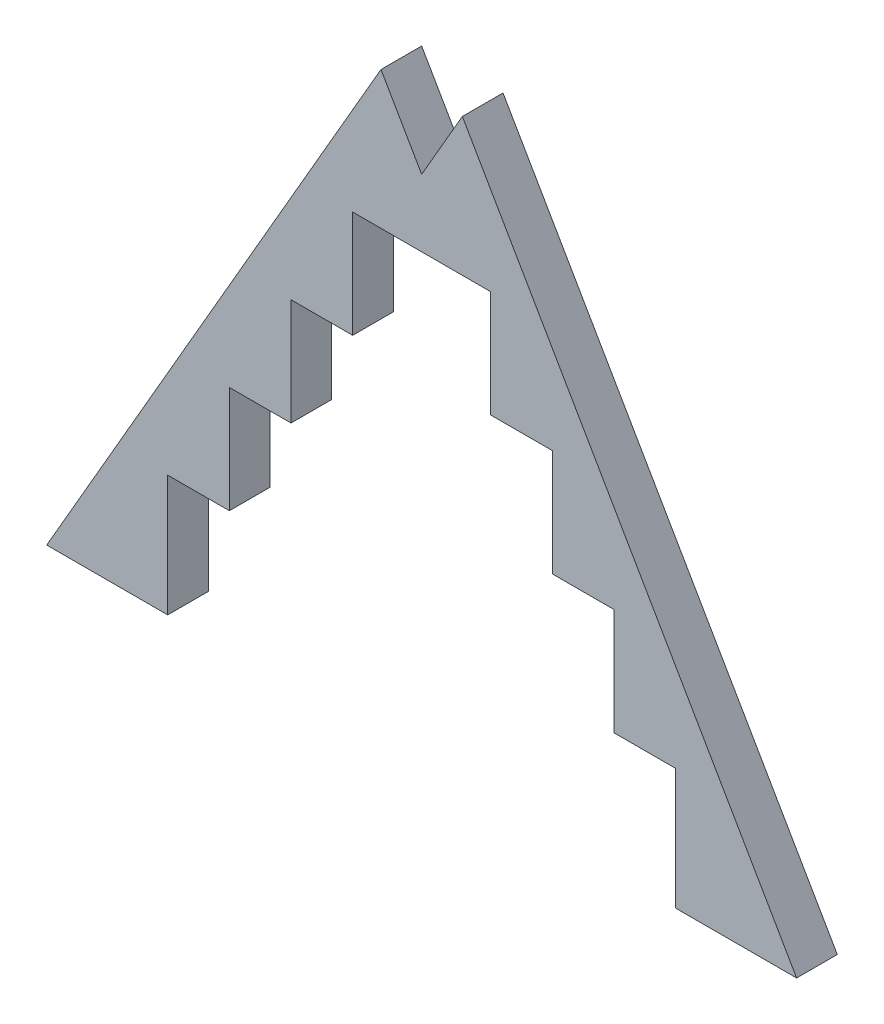
ISO-10303-21;
HEADER;
FILE_DESCRIPTION(('STEP AP214'),'2;1');
FILE_NAME('part.step','',(''),(''),'','','');
FILE_SCHEMA(('AUTOMOTIVE_DESIGN { 1 0 10303 214 1 1 1 1 }'));
ENDSEC;
DATA;
#1=APPLICATION_CONTEXT('core data for automotive mechanical design processes');
#2=APPLICATION_PROTOCOL_DEFINITION('international standard','automotive_design',2000,#1);
#3=PRODUCT_CONTEXT('',#1,'mechanical');
#4=PRODUCT('Part','Part','',(#3));
#5=PRODUCT_RELATED_PRODUCT_CATEGORY('part','',(#4));
#6=PRODUCT_DEFINITION_FORMATION('','',#4);
#7=PRODUCT_DEFINITION_CONTEXT('part definition',#1,'design');
#8=PRODUCT_DEFINITION('design','',#6,#7);
#9=PRODUCT_DEFINITION_SHAPE('','',#8);
#10=(LENGTH_UNIT() NAMED_UNIT(*) SI_UNIT(.MILLI.,.METRE.));
#11=(NAMED_UNIT(*) PLANE_ANGLE_UNIT() SI_UNIT($,.RADIAN.));
#12=(NAMED_UNIT(*) SI_UNIT($,.STERADIAN.) SOLID_ANGLE_UNIT());
#13=UNCERTAINTY_MEASURE_WITH_UNIT(LENGTH_MEASURE(1.E-05),#10,'distance_accuracy_value','');
#14=(GEOMETRIC_REPRESENTATION_CONTEXT(3) GLOBAL_UNCERTAINTY_ASSIGNED_CONTEXT((#13)) GLOBAL_UNIT_ASSIGNED_CONTEXT((#10,
#11,#12)) REPRESENTATION_CONTEXT('',''));
#15=CARTESIAN_POINT('',(0.,0.,0.));
#16=DIRECTION('',(0.,0.,1.));
#17=DIRECTION('',(1.,0.,0.));
#18=AXIS2_PLACEMENT_3D('',#15,#16,#17);
#19=CARTESIAN_POINT('',(-9.45391108675444,5.95,2.));
#20=DIRECTION('',(0.,1.,0.));
#21=DIRECTION('',(0.,0.,1.));
#22=AXIS2_PLACEMENT_3D('',#19,#20,#21);
#23=PLANE('',#22);
#24=DIRECTION('',(1.,0.,0.));
#25=VECTOR('',#24,1.);
#26=CARTESIAN_POINT('',(-9.45391108675444,5.95,0.));
#27=LINE('',#26,#25);
#28=CARTESIAN_POINT('',(-12.485,5.95,0.));
#29=VERTEX_POINT('',#28);
#30=CARTESIAN_POINT('',(-9.45391108675444,5.95,0.));
#31=VERTEX_POINT('',#30);
#32=EDGE_CURVE('E209',#29,#31,#27,.T.);
#33=ORIENTED_EDGE('',*,*,#32,.T.);
#34=DIRECTION('',(0.,0.,-1.));
#35=VECTOR('',#34,1.);
#36=CARTESIAN_POINT('',(-9.45391108675444,5.95,2.));
#37=LINE('',#36,#35);
#38=CARTESIAN_POINT('',(-9.45391108675444,5.95,2.));
#39=VERTEX_POINT('',#38);
#40=EDGE_CURVE('E11',#39,#31,#37,.T.);
#41=ORIENTED_EDGE('',*,*,#40,.F.);
#42=DIRECTION('',(1.,0.,0.));
#43=VECTOR('',#42,1.);
#44=CARTESIAN_POINT('',(-9.45391108675444,5.95,2.));
#45=LINE('',#44,#43);
#46=CARTESIAN_POINT('',(-12.485,5.95,2.));
#47=VERTEX_POINT('',#46);
#48=EDGE_CURVE('E249',#47,#39,#45,.T.);
#49=ORIENTED_EDGE('',*,*,#48,.F.);
#50=DIRECTION('',(0.,0.,-1.));
#51=VECTOR('',#50,1.);
#52=CARTESIAN_POINT('',(-12.485,5.95,2.));
#53=LINE('',#52,#51);
#54=EDGE_CURVE('E205',#47,#29,#53,.T.);
#55=ORIENTED_EDGE('',*,*,#54,.T.);
#56=EDGE_LOOP('',(#33,#41,#49,#55));
#57=FACE_BOUND('',#56,.T.);
#58=ADVANCED_FACE('F35',(#57),#23,.F.);
#59=CARTESIAN_POINT('',(-9.45391108675444,11.2,2.));
#60=DIRECTION('',(-1.,0.,0.));
#61=DIRECTION('',(0.,0.,1.));
#62=AXIS2_PLACEMENT_3D('',#59,#60,#61);
#63=PLANE('',#62);
#64=DIRECTION('',(0.,1.,0.));
#65=VECTOR('',#64,1.);
#66=CARTESIAN_POINT('',(-9.45391108675444,11.2,0.));
#67=LINE('',#66,#65);
#68=CARTESIAN_POINT('',(-9.45391108675444,11.2,0.));
#69=VERTEX_POINT('',#68);
#70=EDGE_CURVE('E212',#31,#69,#67,.T.);
#71=ORIENTED_EDGE('',*,*,#70,.T.);
#72=DIRECTION('',(0.,0.,-1.));
#73=VECTOR('',#72,1.);
#74=CARTESIAN_POINT('',(-9.45391108675444,11.2,2.));
#75=LINE('',#74,#73);
#76=CARTESIAN_POINT('',(-9.45391108675444,11.2,2.));
#77=VERTEX_POINT('',#76);
#78=EDGE_CURVE('E43',#77,#69,#75,.T.);
#79=ORIENTED_EDGE('',*,*,#78,.F.);
#80=DIRECTION('',(0.,1.,0.));
#81=VECTOR('',#80,1.);
#82=CARTESIAN_POINT('',(-9.45391108675444,11.2,2.));
#83=LINE('',#82,#81);
#84=EDGE_CURVE('E133',#39,#77,#83,.T.);
#85=ORIENTED_EDGE('',*,*,#84,.F.);
#86=ORIENTED_EDGE('',*,*,#40,.T.);
#87=EDGE_LOOP('',(#71,#79,#85,#86));
#88=FACE_BOUND('',#87,.T.);
#89=ADVANCED_FACE('F372',(#88),#63,.F.);
#90=CARTESIAN_POINT('',(-6.42282217350887,11.2,2.));
#91=DIRECTION('',(0.,1.,0.));
#92=DIRECTION('',(0.,0.,1.));
#93=AXIS2_PLACEMENT_3D('',#90,#91,#92);
#94=PLANE('',#93);
#95=DIRECTION('',(1.,0.,0.));
#96=VECTOR('',#95,1.);
#97=CARTESIAN_POINT('',(-6.42282217350887,11.2,0.));
#98=LINE('',#97,#96);
#99=CARTESIAN_POINT('',(-6.42282217350887,11.2,0.));
#100=VERTEX_POINT('',#99);
#101=EDGE_CURVE('E214',#69,#100,#98,.T.);
#102=ORIENTED_EDGE('',*,*,#101,.T.);
#103=DIRECTION('',(0.,0.,-1.));
#104=VECTOR('',#103,1.);
#105=CARTESIAN_POINT('',(-6.42282217350887,11.2,2.));
#106=LINE('',#105,#104);
#107=CARTESIAN_POINT('',(-6.42282217350887,11.2,2.));
#108=VERTEX_POINT('',#107);
#109=EDGE_CURVE('E295',#108,#100,#106,.T.);
#110=ORIENTED_EDGE('',*,*,#109,.F.);
#111=DIRECTION('',(1.,0.,0.));
#112=VECTOR('',#111,1.);
#113=CARTESIAN_POINT('',(-6.42282217350887,11.2,2.));
#114=LINE('',#113,#112);
#115=EDGE_CURVE('E303',#77,#108,#114,.T.);
#116=ORIENTED_EDGE('',*,*,#115,.F.);
#117=ORIENTED_EDGE('',*,*,#78,.T.);
#118=EDGE_LOOP('',(#102,#110,#116,#117));
#119=FACE_BOUND('',#118,.T.);
#120=ADVANCED_FACE('F301',(#119),#94,.F.);
#121=CARTESIAN_POINT('',(-6.42282217350887,16.45,2.));
#122=DIRECTION('',(-1.,0.,0.));
#123=DIRECTION('',(0.,0.,1.));
#124=AXIS2_PLACEMENT_3D('',#121,#122,#123);
#125=PLANE('',#124);
#126=DIRECTION('',(0.,1.,0.));
#127=VECTOR('',#126,1.);
#128=CARTESIAN_POINT('',(-6.42282217350887,16.45,0.));
#129=LINE('',#128,#127);
#130=CARTESIAN_POINT('',(-6.42282217350887,16.45,0.));
#131=VERTEX_POINT('',#130);
#132=EDGE_CURVE('E216',#100,#131,#129,.T.);
#133=ORIENTED_EDGE('',*,*,#132,.T.);
#134=DIRECTION('',(0.,0.,-1.));
#135=VECTOR('',#134,1.);
#136=CARTESIAN_POINT('',(-6.42282217350887,16.45,2.));
#137=LINE('',#136,#135);
#138=CARTESIAN_POINT('',(-6.42282217350887,16.45,2.));
#139=VERTEX_POINT('',#138);
#140=EDGE_CURVE('E292',#139,#131,#137,.T.);
#141=ORIENTED_EDGE('',*,*,#140,.F.);
#142=DIRECTION('',(0.,1.,0.));
#143=VECTOR('',#142,1.);
#144=CARTESIAN_POINT('',(-6.42282217350887,16.45,2.));
#145=LINE('',#144,#143);
#146=EDGE_CURVE('E321',#108,#139,#145,.T.);
#147=ORIENTED_EDGE('',*,*,#146,.F.);
#148=ORIENTED_EDGE('',*,*,#109,.T.);
#149=EDGE_LOOP('',(#133,#141,#147,#148));
#150=FACE_BOUND('',#149,.T.);
#151=ADVANCED_FACE('F312',(#150),#125,.F.);
#152=CARTESIAN_POINT('',(-3.3917332602633,16.45,2.));
#153=DIRECTION('',(0.,1.,0.));
#154=DIRECTION('',(0.,0.,1.));
#155=AXIS2_PLACEMENT_3D('',#152,#153,#154);
#156=PLANE('',#155);
#157=DIRECTION('',(1.,0.,0.));
#158=VECTOR('',#157,1.);
#159=CARTESIAN_POINT('',(-3.3917332602633,16.45,0.));
#160=LINE('',#159,#158);
#161=CARTESIAN_POINT('',(-3.3917332602633,16.45,0.));
#162=VERTEX_POINT('',#161);
#163=EDGE_CURVE('E218',#131,#162,#160,.T.);
#164=ORIENTED_EDGE('',*,*,#163,.T.);
#165=DIRECTION('',(0.,0.,-1.));
#166=VECTOR('',#165,1.);
#167=CARTESIAN_POINT('',(-3.3917332602633,16.45,2.));
#168=LINE('',#167,#166);
#169=CARTESIAN_POINT('',(-3.3917332602633,16.45,2.));
#170=VERTEX_POINT('',#169);
#171=EDGE_CURVE('E289',#170,#162,#168,.T.);
#172=ORIENTED_EDGE('',*,*,#171,.F.);
#173=DIRECTION('',(1.,0.,0.));
#174=VECTOR('',#173,1.);
#175=CARTESIAN_POINT('',(-3.3917332602633,16.45,2.));
#176=LINE('',#175,#174);
#177=EDGE_CURVE('E318',#139,#170,#176,.T.);
#178=ORIENTED_EDGE('',*,*,#177,.F.);
#179=ORIENTED_EDGE('',*,*,#140,.T.);
#180=EDGE_LOOP('',(#164,#172,#178,#179));
#181=FACE_BOUND('',#180,.T.);
#182=ADVANCED_FACE('F316',(#181),#156,.F.);
#183=CARTESIAN_POINT('',(-3.3917332602633,21.7,2.));
#184=DIRECTION('',(-1.,0.,0.));
#185=DIRECTION('',(0.,0.,1.));
#186=AXIS2_PLACEMENT_3D('',#183,#184,#185);
#187=PLANE('',#186);
#188=DIRECTION('',(0.,1.,0.));
#189=VECTOR('',#188,1.);
#190=CARTESIAN_POINT('',(-3.3917332602633,21.7,0.));
#191=LINE('',#190,#189);
#192=CARTESIAN_POINT('',(-3.3917332602633,21.7,0.));
#193=VERTEX_POINT('',#192);
#194=EDGE_CURVE('E220',#162,#193,#191,.T.);
#195=ORIENTED_EDGE('',*,*,#194,.T.);
#196=DIRECTION('',(0.,0.,-1.));
#197=VECTOR('',#196,1.);
#198=CARTESIAN_POINT('',(-3.3917332602633,21.7,2.));
#199=LINE('',#198,#197);
#200=CARTESIAN_POINT('',(-3.3917332602633,21.7,2.));
#201=VERTEX_POINT('',#200);
#202=EDGE_CURVE('E286',#201,#193,#199,.T.);
#203=ORIENTED_EDGE('',*,*,#202,.F.);
#204=DIRECTION('',(0.,1.,0.));
#205=VECTOR('',#204,1.);
#206=CARTESIAN_POINT('',(-3.3917332602633,21.7,2.));
#207=LINE('',#206,#205);
#208=EDGE_CURVE('E320',#170,#201,#207,.T.);
#209=ORIENTED_EDGE('',*,*,#208,.F.);
#210=ORIENTED_EDGE('',*,*,#171,.T.);
#211=EDGE_LOOP('',(#195,#203,#209,#210));
#212=FACE_BOUND('',#211,.T.);
#213=ADVANCED_FACE('F385',(#212),#187,.F.);
#214=CARTESIAN_POINT('',(-3.3917332602633,21.7,2.));
#215=DIRECTION('',(0.,1.,0.));
#216=DIRECTION('',(0.,0.,1.));
#217=AXIS2_PLACEMENT_3D('',#214,#215,#216);
#218=PLANE('',#217);
#219=DIRECTION('',(1.,0.,0.));
#220=VECTOR('',#219,1.);
#221=CARTESIAN_POINT('',(-3.3917332602633,21.7,0.));
#222=LINE('',#221,#220);
#223=CARTESIAN_POINT('',(3.3917332602633,21.7,0.));
#224=VERTEX_POINT('',#223);
#225=EDGE_CURVE('E222',#193,#224,#222,.T.);
#226=ORIENTED_EDGE('',*,*,#225,.T.);
#227=DIRECTION('',(0.,0.,-1.));
#228=VECTOR('',#227,1.);
#229=CARTESIAN_POINT('',(3.3917332602633,21.7,2.));
#230=LINE('',#229,#228);
#231=CARTESIAN_POINT('',(3.3917332602633,21.7,2.));
#232=VERTEX_POINT('',#231);
#233=EDGE_CURVE('E283',#232,#224,#230,.T.);
#234=ORIENTED_EDGE('',*,*,#233,.F.);
#235=DIRECTION('',(1.,0.,0.));
#236=VECTOR('',#235,1.);
#237=CARTESIAN_POINT('',(-3.3917332602633,21.7,2.));
#238=LINE('',#237,#236);
#239=EDGE_CURVE('E323',#201,#232,#238,.T.);
#240=ORIENTED_EDGE('',*,*,#239,.F.);
#241=ORIENTED_EDGE('',*,*,#202,.T.);
#242=EDGE_LOOP('',(#226,#234,#240,#241));
#243=FACE_BOUND('',#242,.T.);
#244=ADVANCED_FACE('F388',(#243),#218,.F.);
#245=CARTESIAN_POINT('',(3.3917332602633,21.7,2.));
#246=DIRECTION('',(1.,0.,0.));
#247=DIRECTION('',(0.,0.,-1.));
#248=AXIS2_PLACEMENT_3D('',#245,#246,#247);
#249=PLANE('',#248);
#250=DIRECTION('',(0.,-1.,0.));
#251=VECTOR('',#250,1.);
#252=CARTESIAN_POINT('',(3.3917332602633,21.7,0.));
#253=LINE('',#252,#251);
#254=CARTESIAN_POINT('',(3.3917332602633,16.45,0.));
#255=VERTEX_POINT('',#254);
#256=EDGE_CURVE('E224',#224,#255,#253,.T.);
#257=ORIENTED_EDGE('',*,*,#256,.T.);
#258=DIRECTION('',(0.,0.,-1.));
#259=VECTOR('',#258,1.);
#260=CARTESIAN_POINT('',(3.3917332602633,16.45,2.));
#261=LINE('',#260,#259);
#262=CARTESIAN_POINT('',(3.3917332602633,16.45,2.));
#263=VERTEX_POINT('',#262);
#264=EDGE_CURVE('E280',#263,#255,#261,.T.);
#265=ORIENTED_EDGE('',*,*,#264,.F.);
#266=DIRECTION('',(0.,-1.,0.));
#267=VECTOR('',#266,1.);
#268=CARTESIAN_POINT('',(3.3917332602633,21.7,2.));
#269=LINE('',#268,#267);
#270=EDGE_CURVE('E329',#232,#263,#269,.T.);
#271=ORIENTED_EDGE('',*,*,#270,.F.);
#272=ORIENTED_EDGE('',*,*,#233,.T.);
#273=EDGE_LOOP('',(#257,#265,#271,#272));
#274=FACE_BOUND('',#273,.T.);
#275=ADVANCED_FACE('F392',(#274),#249,.F.);
#276=CARTESIAN_POINT('',(3.3917332602633,16.45,2.));
#277=DIRECTION('',(0.,1.,0.));
#278=DIRECTION('',(0.,0.,1.));
#279=AXIS2_PLACEMENT_3D('',#276,#277,#278);
#280=PLANE('',#279);
#281=DIRECTION('',(1.,0.,0.));
#282=VECTOR('',#281,1.);
#283=CARTESIAN_POINT('',(3.3917332602633,16.45,0.));
#284=LINE('',#283,#282);
#285=CARTESIAN_POINT('',(6.42282217350887,16.45,0.));
#286=VERTEX_POINT('',#285);
#287=EDGE_CURVE('E226',#255,#286,#284,.T.);
#288=ORIENTED_EDGE('',*,*,#287,.T.);
#289=DIRECTION('',(0.,0.,-1.));
#290=VECTOR('',#289,1.);
#291=CARTESIAN_POINT('',(6.42282217350887,16.45,2.));
#292=LINE('',#291,#290);
#293=CARTESIAN_POINT('',(6.42282217350887,16.45,2.));
#294=VERTEX_POINT('',#293);
#295=EDGE_CURVE('E277',#294,#286,#292,.T.);
#296=ORIENTED_EDGE('',*,*,#295,.F.);
#297=DIRECTION('',(1.,0.,0.));
#298=VECTOR('',#297,1.);
#299=CARTESIAN_POINT('',(3.3917332602633,16.45,2.));
#300=LINE('',#299,#298);
#301=EDGE_CURVE('E331',#263,#294,#300,.T.);
#302=ORIENTED_EDGE('',*,*,#301,.F.);
#303=ORIENTED_EDGE('',*,*,#264,.T.);
#304=EDGE_LOOP('',(#288,#296,#302,#303));
#305=FACE_BOUND('',#304,.T.);
#306=ADVANCED_FACE('F396',(#305),#280,.F.);
#307=CARTESIAN_POINT('',(6.42282217350887,16.45,2.));
#308=DIRECTION('',(1.,0.,0.));
#309=DIRECTION('',(0.,0.,-1.));
#310=AXIS2_PLACEMENT_3D('',#307,#308,#309);
#311=PLANE('',#310);
#312=DIRECTION('',(0.,-1.,0.));
#313=VECTOR('',#312,1.);
#314=CARTESIAN_POINT('',(6.42282217350887,16.45,0.));
#315=LINE('',#314,#313);
#316=CARTESIAN_POINT('',(6.42282217350887,11.2,0.));
#317=VERTEX_POINT('',#316);
#318=EDGE_CURVE('E228',#286,#317,#315,.T.);
#319=ORIENTED_EDGE('',*,*,#318,.T.);
#320=DIRECTION('',(0.,0.,-1.));
#321=VECTOR('',#320,1.);
#322=CARTESIAN_POINT('',(6.42282217350887,11.2,2.));
#323=LINE('',#322,#321);
#324=CARTESIAN_POINT('',(6.42282217350887,11.2,2.));
#325=VERTEX_POINT('',#324);
#326=EDGE_CURVE('E274',#325,#317,#323,.T.);
#327=ORIENTED_EDGE('',*,*,#326,.F.);
#328=DIRECTION('',(0.,-1.,0.));
#329=VECTOR('',#328,1.);
#330=CARTESIAN_POINT('',(6.42282217350887,16.45,2.));
#331=LINE('',#330,#329);
#332=EDGE_CURVE('E333',#294,#325,#331,.T.);
#333=ORIENTED_EDGE('',*,*,#332,.F.);
#334=ORIENTED_EDGE('',*,*,#295,.T.);
#335=EDGE_LOOP('',(#319,#327,#333,#334));
#336=FACE_BOUND('',#335,.T.);
#337=ADVANCED_FACE('F400',(#336),#311,.F.);
#338=CARTESIAN_POINT('',(6.42282217350887,11.2,2.));
#339=DIRECTION('',(0.,1.,0.));
#340=DIRECTION('',(0.,0.,1.));
#341=AXIS2_PLACEMENT_3D('',#338,#339,#340);
#342=PLANE('',#341);
#343=DIRECTION('',(1.,0.,0.));
#344=VECTOR('',#343,1.);
#345=CARTESIAN_POINT('',(6.42282217350887,11.2,0.));
#346=LINE('',#345,#344);
#347=CARTESIAN_POINT('',(9.45391108675444,11.2,0.));
#348=VERTEX_POINT('',#347);
#349=EDGE_CURVE('E230',#317,#348,#346,.T.);
#350=ORIENTED_EDGE('',*,*,#349,.T.);
#351=DIRECTION('',(0.,0.,-1.));
#352=VECTOR('',#351,1.);
#353=CARTESIAN_POINT('',(9.45391108675444,11.2,2.));
#354=LINE('',#353,#352);
#355=CARTESIAN_POINT('',(9.45391108675444,11.2,2.));
#356=VERTEX_POINT('',#355);
#357=EDGE_CURVE('E271',#356,#348,#354,.T.);
#358=ORIENTED_EDGE('',*,*,#357,.F.);
#359=DIRECTION('',(1.,0.,0.));
#360=VECTOR('',#359,1.);
#361=CARTESIAN_POINT('',(6.42282217350887,11.2,2.));
#362=LINE('',#361,#360);
#363=EDGE_CURVE('E335',#325,#356,#362,.T.);
#364=ORIENTED_EDGE('',*,*,#363,.F.);
#365=ORIENTED_EDGE('',*,*,#326,.T.);
#366=EDGE_LOOP('',(#350,#358,#364,#365));
#367=FACE_BOUND('',#366,.T.);
#368=ADVANCED_FACE('F404',(#367),#342,.F.);
#369=CARTESIAN_POINT('',(9.45391108675444,11.2,2.));
#370=DIRECTION('',(1.,0.,0.));
#371=DIRECTION('',(0.,0.,-1.));
#372=AXIS2_PLACEMENT_3D('',#369,#370,#371);
#373=PLANE('',#372);
#374=DIRECTION('',(0.,-1.,0.));
#375=VECTOR('',#374,1.);
#376=CARTESIAN_POINT('',(9.45391108675444,11.2,0.));
#377=LINE('',#376,#375);
#378=CARTESIAN_POINT('',(9.45391108675444,5.95,0.));
#379=VERTEX_POINT('',#378);
#380=EDGE_CURVE('E232',#348,#379,#377,.T.);
#381=ORIENTED_EDGE('',*,*,#380,.T.);
#382=DIRECTION('',(0.,0.,-1.));
#383=VECTOR('',#382,1.);
#384=CARTESIAN_POINT('',(9.45391108675444,5.95,2.));
#385=LINE('',#384,#383);
#386=CARTESIAN_POINT('',(9.45391108675444,5.95,2.));
#387=VERTEX_POINT('',#386);
#388=EDGE_CURVE('E268',#387,#379,#385,.T.);
#389=ORIENTED_EDGE('',*,*,#388,.F.);
#390=DIRECTION('',(0.,-1.,0.));
#391=VECTOR('',#390,1.);
#392=CARTESIAN_POINT('',(9.45391108675444,11.2,2.));
#393=LINE('',#392,#391);
#394=EDGE_CURVE('E337',#356,#387,#393,.T.);
#395=ORIENTED_EDGE('',*,*,#394,.F.);
#396=ORIENTED_EDGE('',*,*,#357,.T.);
#397=EDGE_LOOP('',(#381,#389,#395,#396));
#398=FACE_BOUND('',#397,.T.);
#399=ADVANCED_FACE('F408',(#398),#373,.F.);
#400=CARTESIAN_POINT('',(9.45391108675444,5.95,2.));
#401=DIRECTION('',(0.,1.,0.));
#402=DIRECTION('',(0.,0.,1.));
#403=AXIS2_PLACEMENT_3D('',#400,#401,#402);
#404=PLANE('',#403);
#405=DIRECTION('',(1.,0.,0.));
#406=VECTOR('',#405,1.);
#407=CARTESIAN_POINT('',(9.45391108675444,5.95,0.));
#408=LINE('',#407,#406);
#409=CARTESIAN_POINT('',(12.485,5.95,0.));
#410=VERTEX_POINT('',#409);
#411=EDGE_CURVE('E234',#379,#410,#408,.T.);
#412=ORIENTED_EDGE('',*,*,#411,.T.);
#413=DIRECTION('',(0.,0.,-1.));
#414=VECTOR('',#413,1.);
#415=CARTESIAN_POINT('',(12.485,5.95,2.));
#416=LINE('',#415,#414);
#417=CARTESIAN_POINT('',(12.485,5.95,2.));
#418=VERTEX_POINT('',#417);
#419=EDGE_CURVE('E265',#418,#410,#416,.T.);
#420=ORIENTED_EDGE('',*,*,#419,.F.);
#421=DIRECTION('',(1.,0.,0.));
#422=VECTOR('',#421,1.);
#423=CARTESIAN_POINT('',(9.45391108675444,5.95,2.));
#424=LINE('',#423,#422);
#425=EDGE_CURVE('E339',#387,#418,#424,.T.);
#426=ORIENTED_EDGE('',*,*,#425,.F.);
#427=ORIENTED_EDGE('',*,*,#388,.T.);
#428=EDGE_LOOP('',(#412,#420,#426,#427));
#429=FACE_BOUND('',#428,.T.);
#430=ADVANCED_FACE('F412',(#429),#404,.F.);
#431=CARTESIAN_POINT('',(12.485,5.95,2.));
#432=DIRECTION('',(1.,0.,0.));
#433=DIRECTION('',(0.,0.,-1.));
#434=AXIS2_PLACEMENT_3D('',#431,#432,#433);
#435=PLANE('',#434);
#436=DIRECTION('',(0.,-1.,0.));
#437=VECTOR('',#436,1.);
#438=CARTESIAN_POINT('',(12.485,5.95,0.));
#439=LINE('',#438,#437);
#440=CARTESIAN_POINT('',(12.485,0.,0.));
#441=VERTEX_POINT('',#440);
#442=EDGE_CURVE('E236',#410,#441,#439,.T.);
#443=ORIENTED_EDGE('',*,*,#442,.T.);
#444=DIRECTION('',(0.,0.,-1.));
#445=VECTOR('',#444,1.);
#446=CARTESIAN_POINT('',(12.485,0.,2.));
#447=LINE('',#446,#445);
#448=CARTESIAN_POINT('',(12.485,0.,2.));
#449=VERTEX_POINT('',#448);
#450=EDGE_CURVE('E262',#449,#441,#447,.T.);
#451=ORIENTED_EDGE('',*,*,#450,.F.);
#452=DIRECTION('',(0.,-1.,0.));
#453=VECTOR('',#452,1.);
#454=CARTESIAN_POINT('',(12.485,5.95,2.));
#455=LINE('',#454,#453);
#456=EDGE_CURVE('E341',#418,#449,#455,.T.);
#457=ORIENTED_EDGE('',*,*,#456,.F.);
#458=ORIENTED_EDGE('',*,*,#419,.T.);
#459=EDGE_LOOP('',(#443,#451,#457,#458));
#460=FACE_BOUND('',#459,.T.);
#461=ADVANCED_FACE('F416',(#460),#435,.F.);
#462=CARTESIAN_POINT('',(18.4337567297408,0.,2.));
#463=DIRECTION('',(0.,1.,0.));
#464=DIRECTION('',(-1.,0.,0.));
#465=AXIS2_PLACEMENT_3D('',#462,#463,#464);
#466=PLANE('',#465);
#467=DIRECTION('',(1.,0.,0.));
#468=VECTOR('',#467,1.);
#469=CARTESIAN_POINT('',(18.4337567297408,0.,0.));
#470=LINE('',#469,#468);
#471=CARTESIAN_POINT('',(18.4337567297408,0.,0.));
#472=VERTEX_POINT('',#471);
#473=EDGE_CURVE('E238',#441,#472,#470,.T.);
#474=ORIENTED_EDGE('',*,*,#473,.T.);
#475=DIRECTION('',(0.,0.,-1.));
#476=VECTOR('',#475,1.);
#477=CARTESIAN_POINT('',(18.4337567297408,0.,2.));
#478=LINE('',#477,#476);
#479=CARTESIAN_POINT('',(18.4337567297408,0.,2.));
#480=VERTEX_POINT('',#479);
#481=EDGE_CURVE('E259',#480,#472,#478,.T.);
#482=ORIENTED_EDGE('',*,*,#481,.F.);
#483=DIRECTION('',(1.,0.,0.));
#484=VECTOR('',#483,1.);
#485=CARTESIAN_POINT('',(18.4337567297408,0.,2.));
#486=LINE('',#485,#484);
#487=EDGE_CURVE('E343',#449,#480,#486,.T.);
#488=ORIENTED_EDGE('',*,*,#487,.F.);
#489=ORIENTED_EDGE('',*,*,#450,.T.);
#490=EDGE_LOOP('',(#474,#482,#488,#489));
#491=FACE_BOUND('',#490,.T.);
#492=ADVANCED_FACE('F420',(#491),#466,.F.);
#493=CARTESIAN_POINT('',(2.,28.4641016151378,2.));
#494=DIRECTION('',(-0.866025403784436,-0.500000000000004,0.));
#495=DIRECTION('',(0.500000000000004,-0.866025403784436,0.));
#496=AXIS2_PLACEMENT_3D('',#493,#494,#495);
#497=PLANE('',#496);
#498=DIRECTION('',(-0.500000000000004,0.866025403784436,0.));
#499=VECTOR('',#498,1.);
#500=CARTESIAN_POINT('',(2.,28.4641016151378,0.));
#501=LINE('',#500,#499);
#502=CARTESIAN_POINT('',(2.,28.4641016151378,0.));
#503=VERTEX_POINT('',#502);
#504=EDGE_CURVE('E240',#472,#503,#501,.T.);
#505=ORIENTED_EDGE('',*,*,#504,.T.);
#506=DIRECTION('',(0.,0.,-1.));
#507=VECTOR('',#506,1.);
#508=CARTESIAN_POINT('',(2.,28.4641016151378,2.));
#509=LINE('',#508,#507);
#510=CARTESIAN_POINT('',(2.,28.4641016151378,2.));
#511=VERTEX_POINT('',#510);
#512=EDGE_CURVE('E256',#511,#503,#509,.T.);
#513=ORIENTED_EDGE('',*,*,#512,.F.);
#514=DIRECTION('',(-0.500000000000004,0.866025403784436,0.));
#515=VECTOR('',#514,1.);
#516=CARTESIAN_POINT('',(2.,28.4641016151378,2.));
#517=LINE('',#516,#515);
#518=EDGE_CURVE('E345',#480,#511,#517,.T.);
#519=ORIENTED_EDGE('',*,*,#518,.F.);
#520=ORIENTED_EDGE('',*,*,#481,.T.);
#521=EDGE_LOOP('',(#505,#513,#519,#520));
#522=FACE_BOUND('',#521,.T.);
#523=ADVANCED_FACE('F424',(#522),#497,.F.);
#524=CARTESIAN_POINT('',(2.,28.4641016151378,2.));
#525=DIRECTION('',(0.86602540378444,-0.499999999999998,0.));
#526=DIRECTION('',(0.499999999999998,0.86602540378444,0.));
#527=AXIS2_PLACEMENT_3D('',#524,#525,#526);
#528=PLANE('',#527);
#529=DIRECTION('',(-0.499999999999998,-0.86602540378444,0.));
#530=VECTOR('',#529,1.);
#531=CARTESIAN_POINT('',(2.,28.4641016151378,0.));
#532=LINE('',#531,#530);
#533=CARTESIAN_POINT('',(0.,25.,0.));
#534=VERTEX_POINT('',#533);
#535=EDGE_CURVE('E242',#503,#534,#532,.T.);
#536=ORIENTED_EDGE('',*,*,#535,.T.);
#537=DIRECTION('',(0.,0.,-1.));
#538=VECTOR('',#537,1.);
#539=CARTESIAN_POINT('',(0.,25.,2.));
#540=LINE('',#539,#538);
#541=CARTESIAN_POINT('',(0.,25.,2.));
#542=VERTEX_POINT('',#541);
#543=EDGE_CURVE('E253',#542,#534,#540,.T.);
#544=ORIENTED_EDGE('',*,*,#543,.F.);
#545=DIRECTION('',(-0.499999999999998,-0.86602540378444,0.));
#546=VECTOR('',#545,1.);
#547=CARTESIAN_POINT('',(2.,28.4641016151378,2.));
#548=LINE('',#547,#546);
#549=EDGE_CURVE('E347',#511,#542,#548,.T.);
#550=ORIENTED_EDGE('',*,*,#549,.F.);
#551=ORIENTED_EDGE('',*,*,#512,.T.);
#552=EDGE_LOOP('',(#536,#544,#550,#551));
#553=FACE_BOUND('',#552,.T.);
#554=ADVANCED_FACE('F353',(#553),#528,.F.);
#555=CARTESIAN_POINT('',(-2.,28.4641016151378,2.));
#556=DIRECTION('',(-0.86602540378444,-0.499999999999998,0.));
#557=DIRECTION('',(0.499999999999998,-0.86602540378444,0.));
#558=AXIS2_PLACEMENT_3D('',#555,#556,#557);
#559=PLANE('',#558);
#560=DIRECTION('',(-0.499999999999998,0.86602540378444,0.));
#561=VECTOR('',#560,1.);
#562=CARTESIAN_POINT('',(-2.,28.4641016151378,0.));
#563=LINE('',#562,#561);
#564=CARTESIAN_POINT('',(-2.,28.4641016151378,0.));
#565=VERTEX_POINT('',#564);
#566=EDGE_CURVE('E244',#534,#565,#563,.T.);
#567=ORIENTED_EDGE('',*,*,#566,.T.);
#568=DIRECTION('',(0.,0.,-1.));
#569=VECTOR('',#568,1.);
#570=CARTESIAN_POINT('',(-2.,28.4641016151378,2.));
#571=LINE('',#570,#569);
#572=CARTESIAN_POINT('',(-2.,28.4641016151378,2.));
#573=VERTEX_POINT('',#572);
#574=EDGE_CURVE('E200',#573,#565,#571,.T.);
#575=ORIENTED_EDGE('',*,*,#574,.F.);
#576=DIRECTION('',(-0.499999999999998,0.86602540378444,0.));
#577=VECTOR('',#576,1.);
#578=CARTESIAN_POINT('',(-2.,28.4641016151378,2.));
#579=LINE('',#578,#577);
#580=EDGE_CURVE('E191',#542,#573,#579,.T.);
#581=ORIENTED_EDGE('',*,*,#580,.F.);
#582=ORIENTED_EDGE('',*,*,#543,.T.);
#583=EDGE_LOOP('',(#567,#575,#581,#582));
#584=FACE_BOUND('',#583,.T.);
#585=ADVANCED_FACE('F357',(#584),#559,.F.);
#586=CARTESIAN_POINT('',(-2.,28.4641016151378,2.));
#587=DIRECTION('',(0.866025403784436,-0.500000000000004,0.));
#588=DIRECTION('',(0.500000000000004,0.866025403784436,0.));
#589=AXIS2_PLACEMENT_3D('',#586,#587,#588);
#590=PLANE('',#589);
#591=DIRECTION('',(-0.500000000000004,-0.866025403784436,0.));
#592=VECTOR('',#591,1.);
#593=CARTESIAN_POINT('',(-2.,28.4641016151378,0.));
#594=LINE('',#593,#592);
#595=CARTESIAN_POINT('',(-18.4337567297408,0.,0.));
#596=VERTEX_POINT('',#595);
#597=EDGE_CURVE('E199',#565,#596,#594,.T.);
#598=ORIENTED_EDGE('',*,*,#597,.T.);
#599=DIRECTION('',(0.,0.,-1.));
#600=VECTOR('',#599,1.);
#601=CARTESIAN_POINT('',(-18.4337567297408,0.,2.));
#602=LINE('',#601,#600);
#603=CARTESIAN_POINT('',(-18.4337567297408,0.,2.));
#604=VERTEX_POINT('',#603);
#605=EDGE_CURVE('E196',#604,#596,#602,.T.);
#606=ORIENTED_EDGE('',*,*,#605,.F.);
#607=DIRECTION('',(-0.500000000000004,-0.866025403784436,0.));
#608=VECTOR('',#607,1.);
#609=CARTESIAN_POINT('',(-2.,28.4641016151378,2.));
#610=LINE('',#609,#608);
#611=EDGE_CURVE('E185',#573,#604,#610,.T.);
#612=ORIENTED_EDGE('',*,*,#611,.F.);
#613=ORIENTED_EDGE('',*,*,#574,.T.);
#614=EDGE_LOOP('',(#598,#606,#612,#613));
#615=FACE_BOUND('',#614,.T.);
#616=ADVANCED_FACE('F197',(#615),#590,.F.);
#617=CARTESIAN_POINT('',(-18.4337567297408,0.,2.));
#618=DIRECTION('',(0.,1.,0.));
#619=DIRECTION('',(-1.,0.,0.));
#620=AXIS2_PLACEMENT_3D('',#617,#618,#619);
#621=PLANE('',#620);
#622=DIRECTION('',(1.,0.,0.));
#623=VECTOR('',#622,1.);
#624=CARTESIAN_POINT('',(-18.4337567297408,0.,0.));
#625=LINE('',#624,#623);
#626=CARTESIAN_POINT('',(-12.485,0.,0.));
#627=VERTEX_POINT('',#626);
#628=EDGE_CURVE('E119',#596,#627,#625,.T.);
#629=ORIENTED_EDGE('',*,*,#628,.T.);
#630=DIRECTION('',(0.,0.,-1.));
#631=VECTOR('',#630,1.);
#632=CARTESIAN_POINT('',(-12.485,0.,2.));
#633=LINE('',#632,#631);
#634=CARTESIAN_POINT('',(-12.485,0.,2.));
#635=VERTEX_POINT('',#634);
#636=EDGE_CURVE('E201',#635,#627,#633,.T.);
#637=ORIENTED_EDGE('',*,*,#636,.F.);
#638=DIRECTION('',(1.,0.,0.));
#639=VECTOR('',#638,1.);
#640=CARTESIAN_POINT('',(-18.4337567297408,0.,2.));
#641=LINE('',#640,#639);
#642=EDGE_CURVE('E189',#604,#635,#641,.T.);
#643=ORIENTED_EDGE('',*,*,#642,.F.);
#644=ORIENTED_EDGE('',*,*,#605,.T.);
#645=EDGE_LOOP('',(#629,#637,#643,#644));
#646=FACE_BOUND('',#645,.T.);
#647=ADVANCED_FACE('F203',(#646),#621,.F.);
#648=CARTESIAN_POINT('',(-12.485,5.95,2.));
#649=DIRECTION('',(-1.,0.,0.));
#650=DIRECTION('',(0.,0.,1.));
#651=AXIS2_PLACEMENT_3D('',#648,#649,#650);
#652=PLANE('',#651);
#653=DIRECTION('',(0.,1.,0.));
#654=VECTOR('',#653,1.);
#655=CARTESIAN_POINT('',(-12.485,5.95,0.));
#656=LINE('',#655,#654);
#657=EDGE_CURVE('E125',#627,#29,#656,.T.);
#658=ORIENTED_EDGE('',*,*,#657,.T.);
#659=ORIENTED_EDGE('',*,*,#54,.F.);
#660=DIRECTION('',(0.,1.,0.));
#661=VECTOR('',#660,1.);
#662=CARTESIAN_POINT('',(-12.485,5.95,2.));
#663=LINE('',#662,#661);
#664=EDGE_CURVE('E51',#635,#47,#663,.T.);
#665=ORIENTED_EDGE('',*,*,#664,.F.);
#666=ORIENTED_EDGE('',*,*,#636,.T.);
#667=EDGE_LOOP('',(#658,#659,#665,#666));
#668=FACE_BOUND('',#667,.T.);
#669=ADVANCED_FACE('F361',(#668),#652,.F.);
#670=CARTESIAN_POINT('',(0.,0.,2.));
#671=DIRECTION('',(0.,0.,1.));
#672=DIRECTION('',(1.,0.,0.));
#673=AXIS2_PLACEMENT_3D('',#670,#671,#672);
#674=PLANE('',#673);
#675=ORIENTED_EDGE('',*,*,#48,.T.);
#676=ORIENTED_EDGE('',*,*,#84,.T.);
#677=ORIENTED_EDGE('',*,*,#115,.T.);
#678=ORIENTED_EDGE('',*,*,#146,.T.);
#679=ORIENTED_EDGE('',*,*,#177,.T.);
#680=ORIENTED_EDGE('',*,*,#208,.T.);
#681=ORIENTED_EDGE('',*,*,#239,.T.);
#682=ORIENTED_EDGE('',*,*,#270,.T.);
#683=ORIENTED_EDGE('',*,*,#301,.T.);
#684=ORIENTED_EDGE('',*,*,#332,.T.);
#685=ORIENTED_EDGE('',*,*,#363,.T.);
#686=ORIENTED_EDGE('',*,*,#394,.T.);
#687=ORIENTED_EDGE('',*,*,#425,.T.);
#688=ORIENTED_EDGE('',*,*,#456,.T.);
#689=ORIENTED_EDGE('',*,*,#487,.T.);
#690=ORIENTED_EDGE('',*,*,#518,.T.);
#691=ORIENTED_EDGE('',*,*,#549,.T.);
#692=ORIENTED_EDGE('',*,*,#580,.T.);
#693=ORIENTED_EDGE('',*,*,#611,.T.);
#694=ORIENTED_EDGE('',*,*,#642,.T.);
#695=ORIENTED_EDGE('',*,*,#664,.T.);
#696=EDGE_LOOP('',(#675,#676,#677,#678,#679,#680,#681,#682,#683,#684,#685,#686,#687,#688,#689,
#690,#691,#692,#693,#694,#695));
#697=FACE_BOUND('',#696,.T.);
#698=ADVANCED_FACE('F187',(#697),#674,.T.);
#699=CARTESIAN_POINT('',(0.,0.,0.));
#700=DIRECTION('',(0.,0.,1.));
#701=DIRECTION('',(1.,0.,0.));
#702=AXIS2_PLACEMENT_3D('',#699,#700,#701);
#703=PLANE('',#702);
#704=ORIENTED_EDGE('',*,*,#32,.F.);
#705=ORIENTED_EDGE('',*,*,#657,.F.);
#706=ORIENTED_EDGE('',*,*,#628,.F.);
#707=ORIENTED_EDGE('',*,*,#597,.F.);
#708=ORIENTED_EDGE('',*,*,#566,.F.);
#709=ORIENTED_EDGE('',*,*,#535,.F.);
#710=ORIENTED_EDGE('',*,*,#504,.F.);
#711=ORIENTED_EDGE('',*,*,#473,.F.);
#712=ORIENTED_EDGE('',*,*,#442,.F.);
#713=ORIENTED_EDGE('',*,*,#411,.F.);
#714=ORIENTED_EDGE('',*,*,#380,.F.);
#715=ORIENTED_EDGE('',*,*,#349,.F.);
#716=ORIENTED_EDGE('',*,*,#318,.F.);
#717=ORIENTED_EDGE('',*,*,#287,.F.);
#718=ORIENTED_EDGE('',*,*,#256,.F.);
#719=ORIENTED_EDGE('',*,*,#225,.F.);
#720=ORIENTED_EDGE('',*,*,#194,.F.);
#721=ORIENTED_EDGE('',*,*,#163,.F.);
#722=ORIENTED_EDGE('',*,*,#132,.F.);
#723=ORIENTED_EDGE('',*,*,#101,.F.);
#724=ORIENTED_EDGE('',*,*,#70,.F.);
#725=EDGE_LOOP('',(#704,#705,#706,#707,#708,#709,#710,#711,#712,#713,#714,#715,#716,#717,#718,
#719,#720,#721,#722,#723,#724));
#726=FACE_BOUND('',#725,.T.);
#727=ADVANCED_FACE('F307',(#726),#703,.F.);
#728=CLOSED_SHELL('',(#58,#89,#120,#151,#182,#213,#244,#275,#306,#337,#368,#399,#430,#461,#492,
#523,#554,#585,#616,#647,#669,#698,#727));
#729=MANIFOLD_SOLID_BREP('B2',#728);
#730=ADVANCED_BREP_SHAPE_REPRESENTATION('',(#18,#729),#14);
#731=SHAPE_DEFINITION_REPRESENTATION(#9,#730);
ENDSEC;
END-ISO-10303-21;
